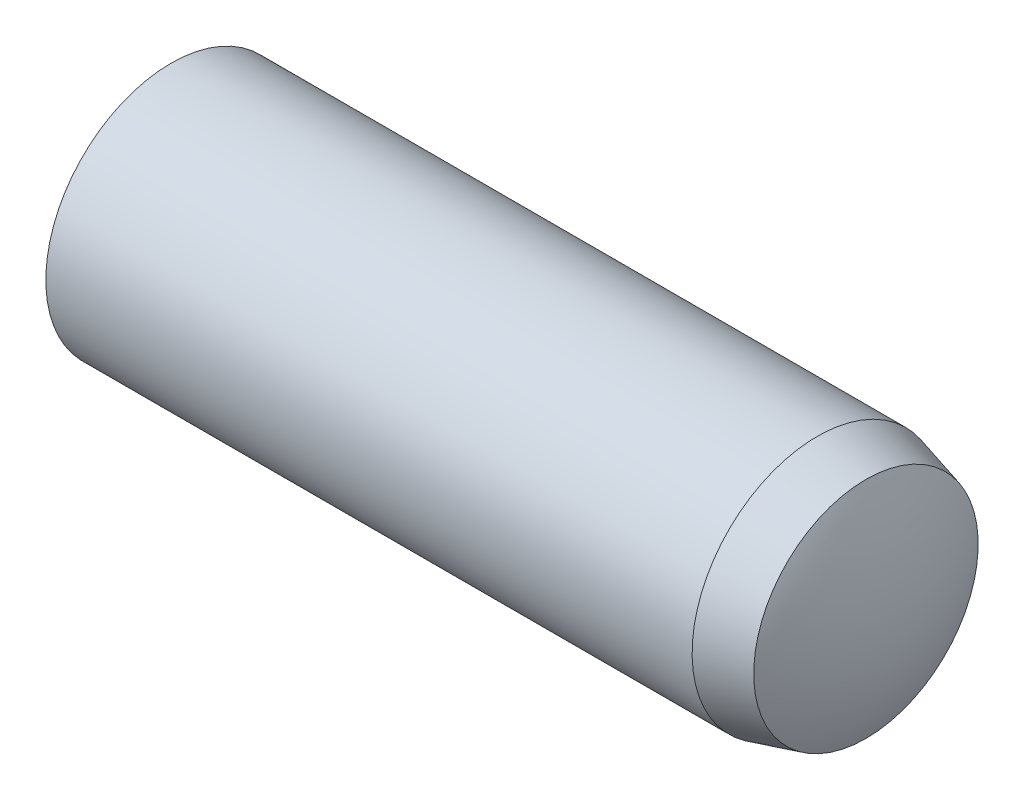
ISO-10303-21;
HEADER;
FILE_DESCRIPTION(('STEP AP214'),'2;1');
FILE_NAME('part.step','',(''),(''),'','','');
FILE_SCHEMA(('AUTOMOTIVE_DESIGN { 1 0 10303 214 1 1 1 1 }'));
ENDSEC;
DATA;
#1=APPLICATION_CONTEXT('core data for automotive mechanical design processes');
#2=APPLICATION_PROTOCOL_DEFINITION('international standard','automotive_design',2000,#1);
#3=PRODUCT_CONTEXT('',#1,'mechanical');
#4=PRODUCT('Part','Part','',(#3));
#5=PRODUCT_RELATED_PRODUCT_CATEGORY('part','',(#4));
#6=PRODUCT_DEFINITION_FORMATION('','',#4);
#7=PRODUCT_DEFINITION_CONTEXT('part definition',#1,'design');
#8=PRODUCT_DEFINITION('design','',#6,#7);
#9=PRODUCT_DEFINITION_SHAPE('','',#8);
#10=(LENGTH_UNIT() NAMED_UNIT(*) SI_UNIT(.MILLI.,.METRE.));
#11=(NAMED_UNIT(*) PLANE_ANGLE_UNIT() SI_UNIT($,.RADIAN.));
#12=(NAMED_UNIT(*) SI_UNIT($,.STERADIAN.) SOLID_ANGLE_UNIT());
#13=UNCERTAINTY_MEASURE_WITH_UNIT(LENGTH_MEASURE(1.E-05),#10,'distance_accuracy_value','');
#14=(GEOMETRIC_REPRESENTATION_CONTEXT(3) GLOBAL_UNCERTAINTY_ASSIGNED_CONTEXT((#13)) GLOBAL_UNIT_ASSIGNED_CONTEXT((#10,
#11,#12)) REPRESENTATION_CONTEXT('',''));
#15=CARTESIAN_POINT('',(0.,0.,0.));
#16=DIRECTION('',(0.,0.,1.));
#17=DIRECTION('',(1.,0.,0.));
#18=AXIS2_PLACEMENT_3D('',#15,#16,#17);
#19=CARTESIAN_POINT('',(11.0166666666667,0.,0.));
#20=DIRECTION('',(-1.,0.,0.));
#21=DIRECTION('',(0.,1.,0.));
#22=AXIS2_PLACEMENT_3D('',#19,#20,#21);
#23=SPHERICAL_SURFACE('',#22,11.0166666666667);
#24=CARTESIAN_POINT('',(1.2,0.,0.));
#25=DIRECTION('',(-1.,0.,0.));
#26=DIRECTION('',(0.,-1.,0.));
#27=AXIS2_PLACEMENT_3D('',#24,#25,#26);
#28=CIRCLE('',#27,5.);
#29=CARTESIAN_POINT('',(1.2,-5.,0.));
#30=VERTEX_POINT('',#29);
#31=EDGE_CURVE('E40',#30,#30,#28,.T.);
#32=ORIENTED_EDGE('',*,*,#31,.T.);
#33=EDGE_LOOP('',(#32));
#34=FACE_BOUND('',#33,.T.);
#35=ADVANCED_FACE('F30',(#34),#23,.T.);
#36=CARTESIAN_POINT('',(20.,0.,0.));
#37=DIRECTION('',(-1.,0.,0.));
#38=DIRECTION('',(0.,-1.,0.));
#39=AXIS2_PLACEMENT_3D('',#36,#37,#38);
#40=SPHERICAL_SURFACE('',#39,10.);
#41=CARTESIAN_POINT('',(28.9402842497203,0.,0.));
#42=DIRECTION('',(-1.,0.,0.));
#43=DIRECTION('',(0.,-1.,0.));
#44=AXIS2_PLACEMENT_3D('',#41,#42,#43);
#45=CIRCLE('',#44,4.48010240220063);
#46=CARTESIAN_POINT('',(28.9402842497203,-4.48010240220063,0.));
#47=VERTEX_POINT('',#46);
#48=EDGE_CURVE('E10',#47,#47,#45,.T.);
#49=ORIENTED_EDGE('',*,*,#48,.F.);
#50=EDGE_LOOP('',(#49));
#51=FACE_BOUND('',#50,.T.);
#52=ADVANCED_FACE('F55',(#51),#40,.T.);
#53=CARTESIAN_POINT('',(28.9402842497203,0.,0.));
#54=DIRECTION('',(-1.,0.,0.));
#55=DIRECTION('',(0.,-1.,0.));
#56=AXIS2_PLACEMENT_3D('',#53,#54,#55);
#57=CONICAL_SURFACE('',#56,4.48010240220063,0.261799387799148);
#58=CARTESIAN_POINT('',(27.,0.,0.));
#59=DIRECTION('',(-1.,0.,0.));
#60=DIRECTION('',(0.,-1.,0.));
#61=AXIS2_PLACEMENT_3D('',#58,#59,#60);
#62=CIRCLE('',#61,5.);
#63=CARTESIAN_POINT('',(27.,-5.,0.));
#64=VERTEX_POINT('',#63);
#65=EDGE_CURVE('E36',#64,#64,#62,.T.);
#66=ORIENTED_EDGE('',*,*,#65,.F.);
#67=EDGE_LOOP('',(#66));
#68=FACE_BOUND('',#67,.T.);
#69=ORIENTED_EDGE('',*,*,#48,.T.);
#70=EDGE_LOOP('',(#69));
#71=FACE_BOUND('',#70,.T.);
#72=ADVANCED_FACE('F50',(#68,#71),#57,.T.);
#73=CARTESIAN_POINT('',(0.,0.,0.));
#74=DIRECTION('',(-1.,0.,0.));
#75=DIRECTION('',(0.,-1.,0.));
#76=AXIS2_PLACEMENT_3D('',#73,#74,#75);
#77=CYLINDRICAL_SURFACE('',#76,5.);
#78=ORIENTED_EDGE('',*,*,#31,.F.);
#79=EDGE_LOOP('',(#78));
#80=FACE_BOUND('',#79,.T.);
#81=ORIENTED_EDGE('',*,*,#65,.T.);
#82=EDGE_LOOP('',(#81));
#83=FACE_BOUND('',#82,.T.);
#84=ADVANCED_FACE('F48',(#80,#83),#77,.T.);
#85=CLOSED_SHELL('',(#35,#52,#72,#84));
#86=MANIFOLD_SOLID_BREP('B2',#85);
#87=ADVANCED_BREP_SHAPE_REPRESENTATION('',(#18,#86),#14);
#88=SHAPE_DEFINITION_REPRESENTATION(#9,#87);
ENDSEC;
END-ISO-10303-21;
